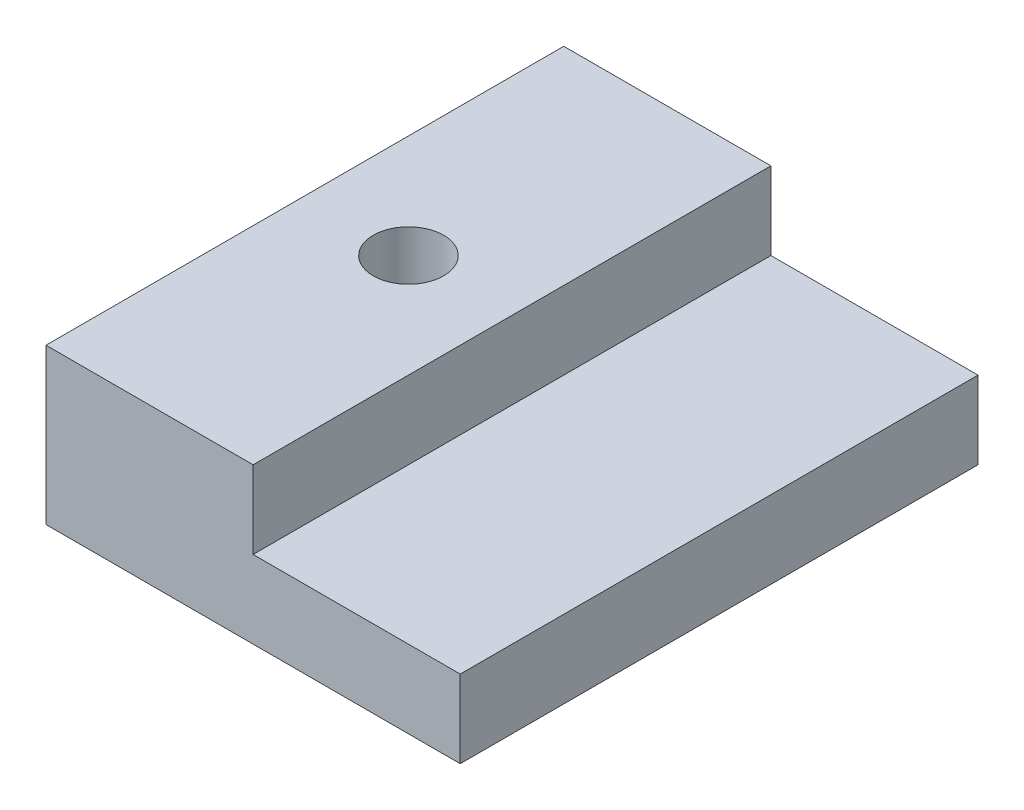
ISO-10303-21;
HEADER;
FILE_DESCRIPTION(('STEP AP214'),'2;1');
FILE_NAME('part.step','',(''),(''),'','','');
FILE_SCHEMA(('AUTOMOTIVE_DESIGN { 1 0 10303 214 1 1 1 1 }'));
ENDSEC;
DATA;
#1=APPLICATION_CONTEXT('core data for automotive mechanical design processes');
#2=APPLICATION_PROTOCOL_DEFINITION('international standard','automotive_design',2000,#1);
#3=PRODUCT_CONTEXT('',#1,'mechanical');
#4=PRODUCT('Part','Part','',(#3));
#5=PRODUCT_RELATED_PRODUCT_CATEGORY('part','',(#4));
#6=PRODUCT_DEFINITION_FORMATION('','',#4);
#7=PRODUCT_DEFINITION_CONTEXT('part definition',#1,'design');
#8=PRODUCT_DEFINITION('design','',#6,#7);
#9=PRODUCT_DEFINITION_SHAPE('','',#8);
#10=(LENGTH_UNIT() NAMED_UNIT(*) SI_UNIT(.MILLI.,.METRE.));
#11=(NAMED_UNIT(*) PLANE_ANGLE_UNIT() SI_UNIT($,.RADIAN.));
#12=(NAMED_UNIT(*) SI_UNIT($,.STERADIAN.) SOLID_ANGLE_UNIT());
#13=UNCERTAINTY_MEASURE_WITH_UNIT(LENGTH_MEASURE(1.E-05),#10,'distance_accuracy_value','');
#14=(GEOMETRIC_REPRESENTATION_CONTEXT(3) GLOBAL_UNCERTAINTY_ASSIGNED_CONTEXT((#13)) GLOBAL_UNIT_ASSIGNED_CONTEXT((#10,
#11,#12)) REPRESENTATION_CONTEXT('',''));
#15=CARTESIAN_POINT('',(0.,0.,0.));
#16=DIRECTION('',(0.,0.,1.));
#17=DIRECTION('',(1.,0.,0.));
#18=AXIS2_PLACEMENT_3D('',#15,#16,#17);
#19=CARTESIAN_POINT('',(0.,15.,0.));
#20=DIRECTION('',(1.,0.,0.));
#21=DIRECTION('',(0.,0.,-1.));
#22=AXIS2_PLACEMENT_3D('',#19,#20,#21);
#23=PLANE('',#22);
#24=DIRECTION('',(0.,0.,1.));
#25=VECTOR('',#24,1.);
#26=CARTESIAN_POINT('',(0.,0.,0.));
#27=LINE('',#26,#25);
#28=CARTESIAN_POINT('',(0.,0.,-50.));
#29=VERTEX_POINT('',#28);
#30=CARTESIAN_POINT('',(0.,0.,0.));
#31=VERTEX_POINT('',#30);
#32=EDGE_CURVE('E127',#29,#31,#27,.T.);
#33=ORIENTED_EDGE('',*,*,#32,.T.);
#34=DIRECTION('',(0.,-1.,0.));
#35=VECTOR('',#34,1.);
#36=CARTESIAN_POINT('',(0.,15.,0.));
#37=LINE('',#36,#35);
#38=CARTESIAN_POINT('',(0.,15.,0.));
#39=VERTEX_POINT('',#38);
#40=EDGE_CURVE('E11',#39,#31,#37,.T.);
#41=ORIENTED_EDGE('',*,*,#40,.F.);
#42=DIRECTION('',(0.,0.,1.));
#43=VECTOR('',#42,1.);
#44=CARTESIAN_POINT('',(0.,15.,0.));
#45=LINE('',#44,#43);
#46=CARTESIAN_POINT('',(0.,15.,-50.));
#47=VERTEX_POINT('',#46);
#48=EDGE_CURVE('E129',#47,#39,#45,.T.);
#49=ORIENTED_EDGE('',*,*,#48,.F.);
#50=DIRECTION('',(0.,-1.,0.));
#51=VECTOR('',#50,1.);
#52=CARTESIAN_POINT('',(0.,15.,-50.));
#53=LINE('',#52,#51);
#54=EDGE_CURVE('E135',#47,#29,#53,.T.);
#55=ORIENTED_EDGE('',*,*,#54,.T.);
#56=EDGE_LOOP('',(#33,#41,#49,#55));
#57=FACE_BOUND('',#56,.T.);
#58=ADVANCED_FACE('F41',(#57),#23,.F.);
#59=CARTESIAN_POINT('',(0.,15.,0.));
#60=DIRECTION('',(0.,0.,-1.));
#61=DIRECTION('',(-1.,0.,0.));
#62=AXIS2_PLACEMENT_3D('',#59,#60,#61);
#63=PLANE('',#62);
#64=DIRECTION('',(1.,0.,0.));
#65=VECTOR('',#64,1.);
#66=CARTESIAN_POINT('',(0.,0.,0.));
#67=LINE('',#66,#65);
#68=CARTESIAN_POINT('',(40.,0.,0.));
#69=VERTEX_POINT('',#68);
#70=EDGE_CURVE('E138',#31,#69,#67,.T.);
#71=ORIENTED_EDGE('',*,*,#70,.T.);
#72=DIRECTION('',(0.,-1.,0.));
#73=VECTOR('',#72,1.);
#74=CARTESIAN_POINT('',(40.,7.5,0.));
#75=LINE('',#74,#73);
#76=CARTESIAN_POINT('',(40.,7.5,0.));
#77=VERTEX_POINT('',#76);
#78=EDGE_CURVE('E109',#77,#69,#75,.T.);
#79=ORIENTED_EDGE('',*,*,#78,.F.);
#80=DIRECTION('',(-1.,0.,0.));
#81=VECTOR('',#80,1.);
#82=CARTESIAN_POINT('',(20.,7.5,0.));
#83=LINE('',#82,#81);
#84=CARTESIAN_POINT('',(20.,7.5,0.));
#85=VERTEX_POINT('',#84);
#86=EDGE_CURVE('E110',#77,#85,#83,.T.);
#87=ORIENTED_EDGE('',*,*,#86,.T.);
#88=DIRECTION('',(0.,-1.,0.));
#89=VECTOR('',#88,1.);
#90=CARTESIAN_POINT('',(20.,15.,0.));
#91=LINE('',#90,#89);
#92=CARTESIAN_POINT('',(20.,15.,0.));
#93=VERTEX_POINT('',#92);
#94=EDGE_CURVE('E48',#93,#85,#91,.T.);
#95=ORIENTED_EDGE('',*,*,#94,.F.);
#96=DIRECTION('',(1.,0.,0.));
#97=VECTOR('',#96,1.);
#98=CARTESIAN_POINT('',(0.,15.,0.));
#99=LINE('',#98,#97);
#100=EDGE_CURVE('E86',#39,#93,#99,.T.);
#101=ORIENTED_EDGE('',*,*,#100,.F.);
#102=ORIENTED_EDGE('',*,*,#40,.T.);
#103=EDGE_LOOP('',(#71,#79,#87,#95,#101,#102));
#104=FACE_BOUND('',#103,.T.);
#105=ADVANCED_FACE('F146',(#104),#63,.F.);
#106=CARTESIAN_POINT('',(20.,15.,0.));
#107=DIRECTION('',(-1.,0.,0.));
#108=DIRECTION('',(0.,0.,1.));
#109=AXIS2_PLACEMENT_3D('',#106,#107,#108);
#110=PLANE('',#109);
#111=ORIENTED_EDGE('',*,*,#94,.T.);
#112=DIRECTION('',(0.,0.,-1.));
#113=VECTOR('',#112,1.);
#114=CARTESIAN_POINT('',(20.,7.5,0.));
#115=LINE('',#114,#113);
#116=CARTESIAN_POINT('',(20.,7.5,-50.));
#117=VERTEX_POINT('',#116);
#118=EDGE_CURVE('E119',#85,#117,#115,.T.);
#119=ORIENTED_EDGE('',*,*,#118,.T.);
#120=DIRECTION('',(0.,-1.,0.));
#121=VECTOR('',#120,1.);
#122=CARTESIAN_POINT('',(20.,15.,-50.));
#123=LINE('',#122,#121);
#124=CARTESIAN_POINT('',(20.,15.,-50.));
#125=VERTEX_POINT('',#124);
#126=EDGE_CURVE('E118',#125,#117,#123,.T.);
#127=ORIENTED_EDGE('',*,*,#126,.F.);
#128=DIRECTION('',(0.,0.,-1.));
#129=VECTOR('',#128,1.);
#130=CARTESIAN_POINT('',(20.,15.,0.));
#131=LINE('',#130,#129);
#132=EDGE_CURVE('E132',#93,#125,#131,.T.);
#133=ORIENTED_EDGE('',*,*,#132,.F.);
#134=EDGE_LOOP('',(#111,#119,#127,#133));
#135=FACE_BOUND('',#134,.T.);
#136=ADVANCED_FACE('F145',(#135),#110,.F.);
#137=CARTESIAN_POINT('',(0.,15.,-50.));
#138=DIRECTION('',(0.,0.,1.));
#139=DIRECTION('',(1.,0.,0.));
#140=AXIS2_PLACEMENT_3D('',#137,#138,#139);
#141=PLANE('',#140);
#142=DIRECTION('',(-1.,0.,0.));
#143=VECTOR('',#142,1.);
#144=CARTESIAN_POINT('',(0.,0.,-50.));
#145=LINE('',#144,#143);
#146=CARTESIAN_POINT('',(40.,0.,-50.));
#147=VERTEX_POINT('',#146);
#148=EDGE_CURVE('E79',#147,#29,#145,.T.);
#149=ORIENTED_EDGE('',*,*,#148,.T.);
#150=ORIENTED_EDGE('',*,*,#54,.F.);
#151=DIRECTION('',(-1.,0.,0.));
#152=VECTOR('',#151,1.);
#153=CARTESIAN_POINT('',(0.,15.,-50.));
#154=LINE('',#153,#152);
#155=EDGE_CURVE('E64',#125,#47,#154,.T.);
#156=ORIENTED_EDGE('',*,*,#155,.F.);
#157=ORIENTED_EDGE('',*,*,#126,.T.);
#158=DIRECTION('',(1.,0.,0.));
#159=VECTOR('',#158,1.);
#160=CARTESIAN_POINT('',(20.,7.5,-50.));
#161=LINE('',#160,#159);
#162=CARTESIAN_POINT('',(40.,7.5,-50.));
#163=VERTEX_POINT('',#162);
#164=EDGE_CURVE('E55',#117,#163,#161,.T.);
#165=ORIENTED_EDGE('',*,*,#164,.T.);
#166=DIRECTION('',(0.,-1.,0.));
#167=VECTOR('',#166,1.);
#168=CARTESIAN_POINT('',(40.,7.5,-50.));
#169=LINE('',#168,#167);
#170=EDGE_CURVE('E102',#163,#147,#169,.T.);
#171=ORIENTED_EDGE('',*,*,#170,.T.);
#172=EDGE_LOOP('',(#149,#150,#156,#157,#165,#171));
#173=FACE_BOUND('',#172,.T.);
#174=ADVANCED_FACE('F116',(#173),#141,.F.);
#175=CARTESIAN_POINT('',(0.,15.,0.));
#176=DIRECTION('',(0.,-1.,0.));
#177=DIRECTION('',(0.,0.,-1.));
#178=AXIS2_PLACEMENT_3D('',#175,#176,#177);
#179=PLANE('',#178);
#180=CARTESIAN_POINT('',(10.,15.,-25.));
#181=DIRECTION('',(0.,1.,0.));
#182=DIRECTION('',(0.,0.,1.));
#183=AXIS2_PLACEMENT_3D('',#180,#181,#182);
#184=CIRCLE('',#183,3.4);
#185=CARTESIAN_POINT('',(10.,15.,-21.6));
#186=VERTEX_POINT('',#185);
#187=EDGE_CURVE('E230',#186,#186,#184,.T.);
#188=ORIENTED_EDGE('',*,*,#187,.F.);
#189=EDGE_LOOP('',(#188));
#190=FACE_BOUND('',#189,.T.);
#191=ORIENTED_EDGE('',*,*,#48,.T.);
#192=ORIENTED_EDGE('',*,*,#100,.T.);
#193=ORIENTED_EDGE('',*,*,#132,.T.);
#194=ORIENTED_EDGE('',*,*,#155,.T.);
#195=EDGE_LOOP('',(#191,#192,#193,#194));
#196=FACE_BOUND('',#195,.T.);
#197=ADVANCED_FACE('F153',(#190,#196),#179,.F.);
#198=CARTESIAN_POINT('',(0.,0.,0.));
#199=DIRECTION('',(0.,-1.,0.));
#200=DIRECTION('',(0.,0.,-1.));
#201=AXIS2_PLACEMENT_3D('',#198,#199,#200);
#202=PLANE('',#201);
#203=CARTESIAN_POINT('',(10.,0.,-25.));
#204=DIRECTION('',(0.,-1.,0.));
#205=DIRECTION('',(0.,0.,-1.));
#206=AXIS2_PLACEMENT_3D('',#203,#204,#205);
#207=CIRCLE('',#206,3.4);
#208=CARTESIAN_POINT('',(10.,0.,-28.4));
#209=VERTEX_POINT('',#208);
#210=EDGE_CURVE('E126',#209,#209,#207,.T.);
#211=ORIENTED_EDGE('',*,*,#210,.F.);
#212=EDGE_LOOP('',(#211));
#213=FACE_BOUND('',#212,.T.);
#214=ORIENTED_EDGE('',*,*,#32,.F.);
#215=ORIENTED_EDGE('',*,*,#148,.F.);
#216=DIRECTION('',(0.,0.,1.));
#217=VECTOR('',#216,1.);
#218=CARTESIAN_POINT('',(40.,0.,0.));
#219=LINE('',#218,#217);
#220=EDGE_CURVE('E108',#147,#69,#219,.T.);
#221=ORIENTED_EDGE('',*,*,#220,.T.);
#222=ORIENTED_EDGE('',*,*,#70,.F.);
#223=EDGE_LOOP('',(#214,#215,#221,#222));
#224=FACE_BOUND('',#223,.T.);
#225=ADVANCED_FACE('F149',(#213,#224),#202,.T.);
#226=CARTESIAN_POINT('',(40.,7.5,0.));
#227=DIRECTION('',(1.,0.,0.));
#228=DIRECTION('',(0.,0.,-1.));
#229=AXIS2_PLACEMENT_3D('',#226,#227,#228);
#230=PLANE('',#229);
#231=ORIENTED_EDGE('',*,*,#220,.F.);
#232=ORIENTED_EDGE('',*,*,#170,.F.);
#233=DIRECTION('',(0.,0.,1.));
#234=VECTOR('',#233,1.);
#235=CARTESIAN_POINT('',(40.,7.5,0.));
#236=LINE('',#235,#234);
#237=EDGE_CURVE('E105',#163,#77,#236,.T.);
#238=ORIENTED_EDGE('',*,*,#237,.T.);
#239=ORIENTED_EDGE('',*,*,#78,.T.);
#240=EDGE_LOOP('',(#231,#232,#238,#239));
#241=FACE_BOUND('',#240,.T.);
#242=ADVANCED_FACE('F103',(#241),#230,.T.);
#243=CARTESIAN_POINT('',(0.,7.5,0.));
#244=DIRECTION('',(0.,-1.,0.));
#245=DIRECTION('',(0.,0.,-1.));
#246=AXIS2_PLACEMENT_3D('',#243,#244,#245);
#247=PLANE('',#246);
#248=ORIENTED_EDGE('',*,*,#118,.F.);
#249=ORIENTED_EDGE('',*,*,#86,.F.);
#250=ORIENTED_EDGE('',*,*,#237,.F.);
#251=ORIENTED_EDGE('',*,*,#164,.F.);
#252=EDGE_LOOP('',(#248,#249,#250,#251));
#253=FACE_BOUND('',#252,.T.);
#254=ADVANCED_FACE('F112',(#253),#247,.F.);
#255=CARTESIAN_POINT('',(10.,15.,-25.));
#256=DIRECTION('',(0.,1.,0.));
#257=DIRECTION('',(0.,0.,1.));
#258=AXIS2_PLACEMENT_3D('',#255,#256,#257);
#259=CYLINDRICAL_SURFACE('',#258,3.4);
#260=ORIENTED_EDGE('',*,*,#187,.T.);
#261=EDGE_LOOP('',(#260));
#262=FACE_BOUND('',#261,.T.);
#263=ORIENTED_EDGE('',*,*,#210,.T.);
#264=EDGE_LOOP('',(#263));
#265=FACE_BOUND('',#264,.T.);
#266=ADVANCED_FACE('F199',(#262,#265),#259,.F.);
#267=CLOSED_SHELL('',(#58,#105,#136,#174,#197,#225,#242,#254,#266));
#268=MANIFOLD_SOLID_BREP('B2',#267);
#269=ADVANCED_BREP_SHAPE_REPRESENTATION('',(#18,#268),#14);
#270=SHAPE_DEFINITION_REPRESENTATION(#9,#269);
ENDSEC;
END-ISO-10303-21;
